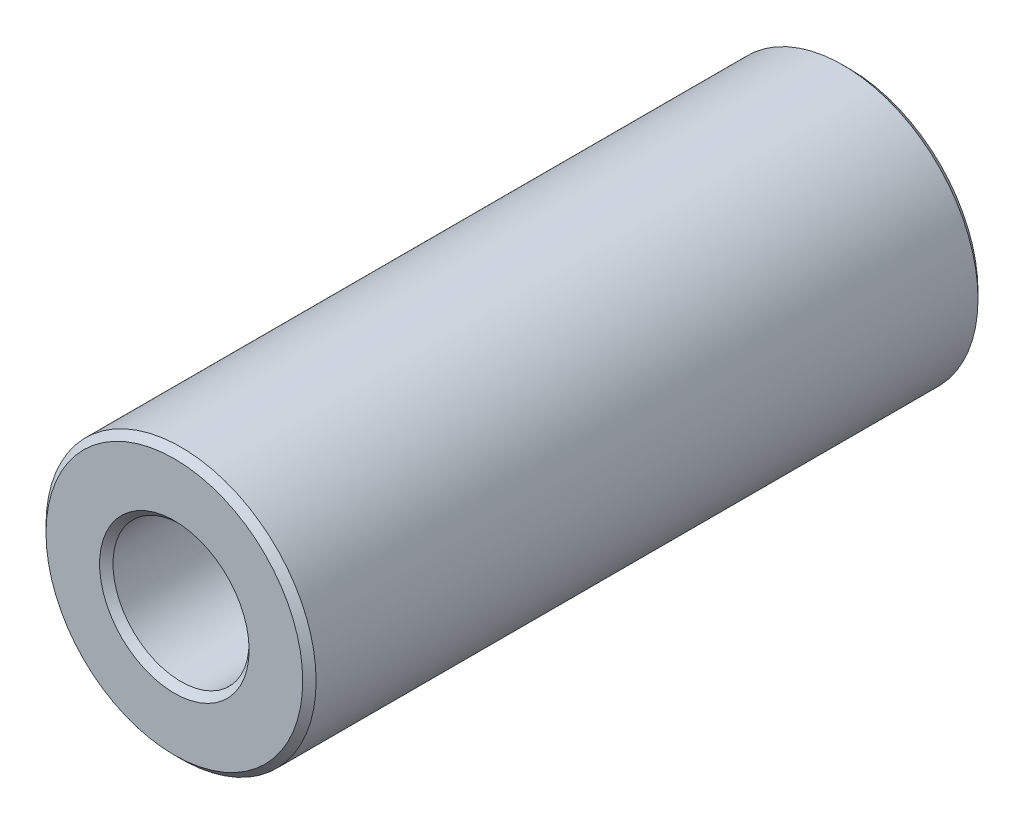
ISO-10303-21;
HEADER;
FILE_DESCRIPTION(('STEP AP214'),'2;1');
FILE_NAME('part.step','',(''),(''),'','','');
FILE_SCHEMA(('AUTOMOTIVE_DESIGN { 1 0 10303 214 1 1 1 1 }'));
ENDSEC;
DATA;
#1=APPLICATION_CONTEXT('core data for automotive mechanical design processes');
#2=APPLICATION_PROTOCOL_DEFINITION('international standard','automotive_design',2000,#1);
#3=PRODUCT_CONTEXT('',#1,'mechanical');
#4=PRODUCT('Part','Part','',(#3));
#5=PRODUCT_RELATED_PRODUCT_CATEGORY('part','',(#4));
#6=PRODUCT_DEFINITION_FORMATION('','',#4);
#7=PRODUCT_DEFINITION_CONTEXT('part definition',#1,'design');
#8=PRODUCT_DEFINITION('design','',#6,#7);
#9=PRODUCT_DEFINITION_SHAPE('','',#8);
#10=(LENGTH_UNIT() NAMED_UNIT(*) SI_UNIT(.MILLI.,.METRE.));
#11=(NAMED_UNIT(*) PLANE_ANGLE_UNIT() SI_UNIT($,.RADIAN.));
#12=(NAMED_UNIT(*) SI_UNIT($,.STERADIAN.) SOLID_ANGLE_UNIT());
#13=UNCERTAINTY_MEASURE_WITH_UNIT(LENGTH_MEASURE(1.E-05),#10,'distance_accuracy_value','');
#14=(GEOMETRIC_REPRESENTATION_CONTEXT(3) GLOBAL_UNCERTAINTY_ASSIGNED_CONTEXT((#13)) GLOBAL_UNIT_ASSIGNED_CONTEXT((#10,
#11,#12)) REPRESENTATION_CONTEXT('',''));
#15=CARTESIAN_POINT('',(0.,0.,0.));
#16=DIRECTION('',(0.,0.,1.));
#17=DIRECTION('',(1.,0.,0.));
#18=AXIS2_PLACEMENT_3D('',#15,#16,#17);
#19=CARTESIAN_POINT('',(0.,0.,-15.875));
#20=DIRECTION('',(0.,0.,1.));
#21=DIRECTION('',(1.,0.,0.));
#22=AXIS2_PLACEMENT_3D('',#19,#20,#21);
#23=CYLINDRICAL_SURFACE('',#22,6.35);
#24=CARTESIAN_POINT('',(0.,0.,15.56004));
#25=DIRECTION('',(0.,0.,1.));
#26=DIRECTION('',(1.,0.,0.));
#27=AXIS2_PLACEMENT_3D('',#24,#25,#26);
#28=CIRCLE('',#27,6.35);
#29=CARTESIAN_POINT('',(6.35,0.,15.56004));
#30=VERTEX_POINT('',#29);
#31=EDGE_CURVE('E65',#30,#30,#28,.F.);
#32=ORIENTED_EDGE('',*,*,#31,.T.);
#33=EDGE_LOOP('',(#32));
#34=FACE_BOUND('',#33,.T.);
#35=CARTESIAN_POINT('',(0.,0.,-15.56004));
#36=DIRECTION('',(0.,0.,1.));
#37=DIRECTION('',(1.,0.,0.));
#38=AXIS2_PLACEMENT_3D('',#35,#36,#37);
#39=CIRCLE('',#38,6.35);
#40=CARTESIAN_POINT('',(6.35,0.,-15.56004));
#41=VERTEX_POINT('',#40);
#42=EDGE_CURVE('E69',#41,#41,#39,.T.);
#43=ORIENTED_EDGE('',*,*,#42,.T.);
#44=EDGE_LOOP('',(#43));
#45=FACE_BOUND('',#44,.T.);
#46=ADVANCED_FACE('F39',(#34,#45),#23,.T.);
#47=CARTESIAN_POINT('',(0.,0.,-15.875));
#48=DIRECTION('',(0.,0.,1.));
#49=DIRECTION('',(1.,0.,0.));
#50=AXIS2_PLACEMENT_3D('',#47,#48,#49);
#51=PLANE('',#50);
#52=CARTESIAN_POINT('',(0.,0.,-15.875));
#53=DIRECTION('',(0.,0.,1.));
#54=DIRECTION('',(1.,0.,0.));
#55=AXIS2_PLACEMENT_3D('',#52,#53,#54);
#56=CIRCLE('',#55,6.03504);
#57=CARTESIAN_POINT('',(6.03504,0.,-15.875));
#58=VERTEX_POINT('',#57);
#59=EDGE_CURVE('E53',#58,#58,#56,.F.);
#60=ORIENTED_EDGE('',*,*,#59,.T.);
#61=EDGE_LOOP('',(#60));
#62=FACE_BOUND('',#61,.T.);
#63=CARTESIAN_POINT('',(0.,0.,-15.875));
#64=DIRECTION('',(0.,0.,1.));
#65=DIRECTION('',(1.,0.,0.));
#66=AXIS2_PLACEMENT_3D('',#63,#64,#65);
#67=CIRCLE('',#66,3.51536000000001);
#68=CARTESIAN_POINT('',(3.51536000000001,0.,-15.875));
#69=VERTEX_POINT('',#68);
#70=EDGE_CURVE('E59',#69,#69,#67,.T.);
#71=ORIENTED_EDGE('',*,*,#70,.T.);
#72=EDGE_LOOP('',(#71));
#73=FACE_BOUND('',#72,.T.);
#74=ADVANCED_FACE('F98',(#62,#73),#51,.F.);
#75=CARTESIAN_POINT('',(0.,0.,-15.875));
#76=DIRECTION('',(0.,0.,1.));
#77=DIRECTION('',(1.,0.,0.));
#78=AXIS2_PLACEMENT_3D('',#75,#76,#77);
#79=CYLINDRICAL_SURFACE('',#78,3.2004);
#80=CARTESIAN_POINT('',(0.,0.,15.56004));
#81=DIRECTION('',(0.,0.,1.));
#82=DIRECTION('',(1.,0.,0.));
#83=AXIS2_PLACEMENT_3D('',#80,#81,#82);
#84=CIRCLE('',#83,3.2004);
#85=CARTESIAN_POINT('',(3.2004,0.,15.56004));
#86=VERTEX_POINT('',#85);
#87=EDGE_CURVE('E10',#86,#86,#84,.T.);
#88=ORIENTED_EDGE('',*,*,#87,.T.);
#89=EDGE_LOOP('',(#88));
#90=FACE_BOUND('',#89,.T.);
#91=CARTESIAN_POINT('',(0.,0.,-15.56004));
#92=DIRECTION('',(0.,0.,1.));
#93=DIRECTION('',(1.,0.,0.));
#94=AXIS2_PLACEMENT_3D('',#91,#92,#93);
#95=CIRCLE('',#94,3.2004);
#96=CARTESIAN_POINT('',(3.2004,0.,-15.56004));
#97=VERTEX_POINT('',#96);
#98=EDGE_CURVE('E47',#97,#97,#95,.F.);
#99=ORIENTED_EDGE('',*,*,#98,.T.);
#100=EDGE_LOOP('',(#99));
#101=FACE_BOUND('',#100,.T.);
#102=ADVANCED_FACE('F104',(#90,#101),#79,.F.);
#103=CARTESIAN_POINT('',(0.,0.,15.875));
#104=DIRECTION('',(0.,0.,1.));
#105=DIRECTION('',(1.,0.,0.));
#106=AXIS2_PLACEMENT_3D('',#103,#104,#105);
#107=PLANE('',#106);
#108=CARTESIAN_POINT('',(0.,0.,15.875));
#109=DIRECTION('',(0.,0.,1.));
#110=DIRECTION('',(1.,0.,0.));
#111=AXIS2_PLACEMENT_3D('',#108,#109,#110);
#112=CIRCLE('',#111,6.03504);
#113=CARTESIAN_POINT('',(6.03504,0.,15.875));
#114=VERTEX_POINT('',#113);
#115=EDGE_CURVE('E73',#114,#114,#112,.T.);
#116=ORIENTED_EDGE('',*,*,#115,.T.);
#117=EDGE_LOOP('',(#116));
#118=FACE_BOUND('',#117,.T.);
#119=CARTESIAN_POINT('',(0.,0.,15.875));
#120=DIRECTION('',(0.,0.,1.));
#121=DIRECTION('',(1.,0.,0.));
#122=AXIS2_PLACEMENT_3D('',#119,#120,#121);
#123=CIRCLE('',#122,3.51536);
#124=CARTESIAN_POINT('',(3.51536,0.,15.875));
#125=VERTEX_POINT('',#124);
#126=EDGE_CURVE('E77',#125,#125,#123,.F.);
#127=ORIENTED_EDGE('',*,*,#126,.T.);
#128=EDGE_LOOP('',(#127));
#129=FACE_BOUND('',#128,.T.);
#130=ADVANCED_FACE('F83',(#118,#129),#107,.T.);
#131=CARTESIAN_POINT('',(0.,0.,15.875));
#132=DIRECTION('',(0.,0.,-1.));
#133=DIRECTION('',(-1.,0.,0.));
#134=AXIS2_PLACEMENT_3D('',#131,#132,#133);
#135=CONICAL_SURFACE('',#134,6.03504,0.785398163397451);
#136=ORIENTED_EDGE('',*,*,#31,.F.);
#137=EDGE_LOOP('',(#136));
#138=FACE_BOUND('',#137,.T.);
#139=ORIENTED_EDGE('',*,*,#115,.F.);
#140=EDGE_LOOP('',(#139));
#141=FACE_BOUND('',#140,.T.);
#142=ADVANCED_FACE('F94',(#138,#141),#135,.T.);
#143=CARTESIAN_POINT('',(0.,0.,-15.56004));
#144=DIRECTION('',(0.,0.,1.));
#145=DIRECTION('',(1.,0.,0.));
#146=AXIS2_PLACEMENT_3D('',#143,#144,#145);
#147=CONICAL_SURFACE('',#146,6.35,0.785398163397451);
#148=ORIENTED_EDGE('',*,*,#59,.F.);
#149=EDGE_LOOP('',(#148));
#150=FACE_BOUND('',#149,.T.);
#151=ORIENTED_EDGE('',*,*,#42,.F.);
#152=EDGE_LOOP('',(#151));
#153=FACE_BOUND('',#152,.T.);
#154=ADVANCED_FACE('F88',(#150,#153),#147,.T.);
#155=CARTESIAN_POINT('',(0.,0.,15.56004));
#156=DIRECTION('',(0.,0.,1.));
#157=DIRECTION('',(1.,0.,0.));
#158=AXIS2_PLACEMENT_3D('',#155,#156,#157);
#159=CONICAL_SURFACE('',#158,3.2004,0.785398163397452);
#160=ORIENTED_EDGE('',*,*,#126,.F.);
#161=EDGE_LOOP('',(#160));
#162=FACE_BOUND('',#161,.T.);
#163=ORIENTED_EDGE('',*,*,#87,.F.);
#164=EDGE_LOOP('',(#163));
#165=FACE_BOUND('',#164,.T.);
#166=ADVANCED_FACE('F85',(#162,#165),#159,.F.);
#167=CARTESIAN_POINT('',(0.,0.,-15.875));
#168=DIRECTION('',(0.,0.,-1.));
#169=DIRECTION('',(-1.,0.,0.));
#170=AXIS2_PLACEMENT_3D('',#167,#168,#169);
#171=CONICAL_SURFACE('',#170,3.51536000000001,0.785398163397445);
#172=ORIENTED_EDGE('',*,*,#98,.F.);
#173=EDGE_LOOP('',(#172));
#174=FACE_BOUND('',#173,.T.);
#175=ORIENTED_EDGE('',*,*,#70,.F.);
#176=EDGE_LOOP('',(#175));
#177=FACE_BOUND('',#176,.T.);
#178=ADVANCED_FACE('F41',(#174,#177),#171,.F.);
#179=CLOSED_SHELL('',(#46,#74,#102,#130,#142,#154,#166,#178));
#180=MANIFOLD_SOLID_BREP('B2',#179);
#181=ADVANCED_BREP_SHAPE_REPRESENTATION('',(#18,#180),#14);
#182=SHAPE_DEFINITION_REPRESENTATION(#9,#181);
ENDSEC;
END-ISO-10303-21;
